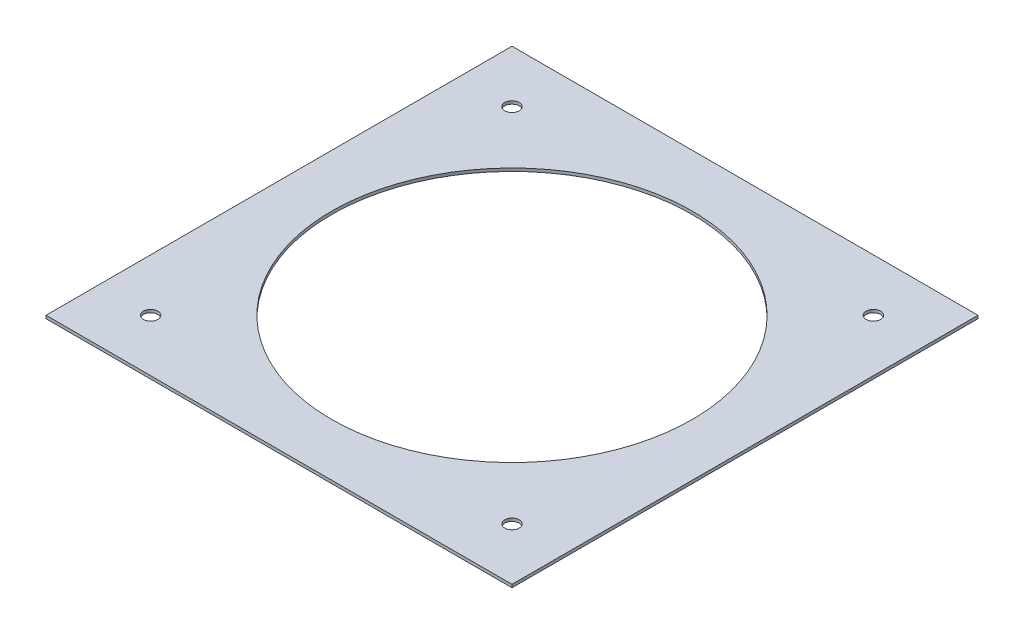
ISO-10303-21;
HEADER;
FILE_DESCRIPTION(('STEP AP214'),'2;1');
FILE_NAME('part.step','',(''),(''),'','','');
FILE_SCHEMA(('AUTOMOTIVE_DESIGN { 1 0 10303 214 1 1 1 1 }'));
ENDSEC;
DATA;
#1=APPLICATION_CONTEXT('core data for automotive mechanical design processes');
#2=APPLICATION_PROTOCOL_DEFINITION('international standard','automotive_design',2000,#1);
#3=PRODUCT_CONTEXT('',#1,'mechanical');
#4=PRODUCT('Part','Part','',(#3));
#5=PRODUCT_RELATED_PRODUCT_CATEGORY('part','',(#4));
#6=PRODUCT_DEFINITION_FORMATION('','',#4);
#7=PRODUCT_DEFINITION_CONTEXT('part definition',#1,'design');
#8=PRODUCT_DEFINITION('design','',#6,#7);
#9=PRODUCT_DEFINITION_SHAPE('','',#8);
#10=(LENGTH_UNIT() NAMED_UNIT(*) SI_UNIT(.MILLI.,.METRE.));
#11=(NAMED_UNIT(*) PLANE_ANGLE_UNIT() SI_UNIT($,.RADIAN.));
#12=(NAMED_UNIT(*) SI_UNIT($,.STERADIAN.) SOLID_ANGLE_UNIT());
#13=UNCERTAINTY_MEASURE_WITH_UNIT(LENGTH_MEASURE(1.E-05),#10,'distance_accuracy_value','');
#14=(GEOMETRIC_REPRESENTATION_CONTEXT(3) GLOBAL_UNCERTAINTY_ASSIGNED_CONTEXT((#13)) GLOBAL_UNIT_ASSIGNED_CONTEXT((#10,
#11,#12)) REPRESENTATION_CONTEXT('',''));
#15=CARTESIAN_POINT('',(0.,0.,0.));
#16=DIRECTION('',(0.,0.,1.));
#17=DIRECTION('',(1.,0.,0.));
#18=AXIS2_PLACEMENT_3D('',#15,#16,#17);
#19=CARTESIAN_POINT('',(0.,1.,77.5));
#20=DIRECTION('',(0.,0.,-1.));
#21=DIRECTION('',(-1.,0.,0.));
#22=AXIS2_PLACEMENT_3D('',#19,#20,#21);
#23=PLANE('',#22);
#24=DIRECTION('',(1.,0.,0.));
#25=VECTOR('',#24,1.);
#26=CARTESIAN_POINT('',(0.,0.,77.5));
#27=LINE('',#26,#25);
#28=CARTESIAN_POINT('',(-77.497806420569,0.,77.5));
#29=VERTEX_POINT('',#28);
#30=CARTESIAN_POINT('',(77.497806420569,0.,77.5));
#31=VERTEX_POINT('',#30);
#32=EDGE_CURVE('E155',#29,#31,#27,.T.);
#33=ORIENTED_EDGE('',*,*,#32,.T.);
#34=DIRECTION('',(0.,-1.,0.));
#35=VECTOR('',#34,1.);
#36=CARTESIAN_POINT('',(77.497806420569,1.,77.5));
#37=LINE('',#36,#35);
#38=CARTESIAN_POINT('',(77.497806420569,1.,77.5));
#39=VERTEX_POINT('',#38);
#40=EDGE_CURVE('E11',#39,#31,#37,.T.);
#41=ORIENTED_EDGE('',*,*,#40,.F.);
#42=DIRECTION('',(1.,0.,0.));
#43=VECTOR('',#42,1.);
#44=CARTESIAN_POINT('',(0.,1.,77.5));
#45=LINE('',#44,#43);
#46=CARTESIAN_POINT('',(-77.497806420569,1.,77.5));
#47=VERTEX_POINT('',#46);
#48=EDGE_CURVE('E201',#47,#39,#45,.T.);
#49=ORIENTED_EDGE('',*,*,#48,.F.);
#50=DIRECTION('',(0.,-1.,0.));
#51=VECTOR('',#50,1.);
#52=CARTESIAN_POINT('',(-77.497806420569,1.,77.5));
#53=LINE('',#52,#51);
#54=EDGE_CURVE('E147',#47,#29,#53,.T.);
#55=ORIENTED_EDGE('',*,*,#54,.T.);
#56=EDGE_LOOP('',(#33,#41,#49,#55));
#57=FACE_BOUND('',#56,.T.);
#58=ADVANCED_FACE('F44',(#57),#23,.F.);
#59=CARTESIAN_POINT('',(0.,1.,0.));
#60=DIRECTION('',(0.,-1.,0.));
#61=DIRECTION('',(0.,0.,-1.));
#62=AXIS2_PLACEMENT_3D('',#59,#60,#61);
#63=CYLINDRICAL_SURFACE('',#62,109.6);
#64=CARTESIAN_POINT('',(0.,0.,0.));
#65=DIRECTION('',(0.,1.,0.));
#66=DIRECTION('',(0.,0.,1.));
#67=AXIS2_PLACEMENT_3D('',#64,#65,#66);
#68=CIRCLE('',#67,109.6);
#69=CARTESIAN_POINT('',(77.5,0.,77.497806420569));
#70=VERTEX_POINT('',#69);
#71=EDGE_CURVE('E158',#31,#70,#68,.T.);
#72=ORIENTED_EDGE('',*,*,#71,.T.);
#73=DIRECTION('',(0.,-1.,0.));
#74=VECTOR('',#73,1.);
#75=CARTESIAN_POINT('',(77.5,1.,77.497806420569));
#76=LINE('',#75,#74);
#77=CARTESIAN_POINT('',(77.5,1.,77.497806420569));
#78=VERTEX_POINT('',#77);
#79=EDGE_CURVE('E53',#78,#70,#76,.T.);
#80=ORIENTED_EDGE('',*,*,#79,.F.);
#81=CARTESIAN_POINT('',(0.,1.,0.));
#82=DIRECTION('',(0.,1.,0.));
#83=DIRECTION('',(0.,0.,1.));
#84=AXIS2_PLACEMENT_3D('',#81,#82,#83);
#85=CIRCLE('',#84,109.6);
#86=EDGE_CURVE('E104',#39,#78,#85,.T.);
#87=ORIENTED_EDGE('',*,*,#86,.F.);
#88=ORIENTED_EDGE('',*,*,#40,.T.);
#89=EDGE_LOOP('',(#72,#80,#87,#88));
#90=FACE_BOUND('',#89,.T.);
#91=ADVANCED_FACE('F188',(#90),#63,.T.);
#92=CARTESIAN_POINT('',(77.5,1.,0.));
#93=DIRECTION('',(1.,0.,0.));
#94=DIRECTION('',(0.,0.,-1.));
#95=AXIS2_PLACEMENT_3D('',#92,#93,#94);
#96=PLANE('',#95);
#97=DIRECTION('',(0.,0.,1.));
#98=VECTOR('',#97,1.);
#99=CARTESIAN_POINT('',(77.5,0.,0.));
#100=LINE('',#99,#98);
#101=CARTESIAN_POINT('',(77.5,0.,-77.497806420569));
#102=VERTEX_POINT('',#101);
#103=EDGE_CURVE('E161',#102,#70,#100,.T.);
#104=ORIENTED_EDGE('',*,*,#103,.F.);
#105=DIRECTION('',(0.,-1.,0.));
#106=VECTOR('',#105,1.);
#107=CARTESIAN_POINT('',(77.5,1.,-77.497806420569));
#108=LINE('',#107,#106);
#109=CARTESIAN_POINT('',(77.5,1.,-77.497806420569));
#110=VERTEX_POINT('',#109);
#111=EDGE_CURVE('E181',#110,#102,#108,.T.);
#112=ORIENTED_EDGE('',*,*,#111,.F.);
#113=DIRECTION('',(0.,0.,1.));
#114=VECTOR('',#113,1.);
#115=CARTESIAN_POINT('',(77.5,1.,0.));
#116=LINE('',#115,#114);
#117=EDGE_CURVE('E187',#110,#78,#116,.T.);
#118=ORIENTED_EDGE('',*,*,#117,.T.);
#119=ORIENTED_EDGE('',*,*,#79,.T.);
#120=EDGE_LOOP('',(#104,#112,#118,#119));
#121=FACE_BOUND('',#120,.T.);
#122=ADVANCED_FACE('F185',(#121),#96,.T.);
#123=CARTESIAN_POINT('',(77.4978064205691,0.,-77.5));
#124=VERTEX_POINT('',#123);
#125=EDGE_CURVE('E162',#102,#124,#68,.T.);
#126=ORIENTED_EDGE('',*,*,#125,.T.);
#127=DIRECTION('',(0.,-1.,0.));
#128=VECTOR('',#127,1.);
#129=CARTESIAN_POINT('',(77.4978064205691,1.,-77.5));
#130=LINE('',#129,#128);
#131=CARTESIAN_POINT('',(77.4978064205691,1.,-77.5));
#132=VERTEX_POINT('',#131);
#133=EDGE_CURVE('E179',#132,#124,#130,.T.);
#134=ORIENTED_EDGE('',*,*,#133,.F.);
#135=EDGE_CURVE('E128',#110,#132,#85,.T.);
#136=ORIENTED_EDGE('',*,*,#135,.F.);
#137=ORIENTED_EDGE('',*,*,#111,.T.);
#138=EDGE_LOOP('',(#126,#134,#136,#137));
#139=FACE_BOUND('',#138,.T.);
#140=ADVANCED_FACE('F199',(#139),#63,.T.);
#141=CARTESIAN_POINT('',(0.,1.,-77.5));
#142=DIRECTION('',(0.,0.,-1.));
#143=DIRECTION('',(-1.,0.,0.));
#144=AXIS2_PLACEMENT_3D('',#141,#142,#143);
#145=PLANE('',#144);
#146=DIRECTION('',(1.,0.,0.));
#147=VECTOR('',#146,1.);
#148=CARTESIAN_POINT('',(0.,0.,-77.5));
#149=LINE('',#148,#147);
#150=CARTESIAN_POINT('',(-77.4978064205691,0.,-77.5));
#151=VERTEX_POINT('',#150);
#152=EDGE_CURVE('E165',#151,#124,#149,.T.);
#153=ORIENTED_EDGE('',*,*,#152,.F.);
#154=DIRECTION('',(0.,-1.,0.));
#155=VECTOR('',#154,1.);
#156=CARTESIAN_POINT('',(-77.4978064205691,1.,-77.5));
#157=LINE('',#156,#155);
#158=CARTESIAN_POINT('',(-77.4978064205691,1.,-77.5));
#159=VERTEX_POINT('',#158);
#160=EDGE_CURVE('E133',#159,#151,#157,.T.);
#161=ORIENTED_EDGE('',*,*,#160,.F.);
#162=DIRECTION('',(1.,0.,0.));
#163=VECTOR('',#162,1.);
#164=CARTESIAN_POINT('',(0.,1.,-77.5));
#165=LINE('',#164,#163);
#166=EDGE_CURVE('E125',#159,#132,#165,.T.);
#167=ORIENTED_EDGE('',*,*,#166,.T.);
#168=ORIENTED_EDGE('',*,*,#133,.T.);
#169=EDGE_LOOP('',(#153,#161,#167,#168));
#170=FACE_BOUND('',#169,.T.);
#171=ADVANCED_FACE('F252',(#170),#145,.T.);
#172=CARTESIAN_POINT('',(-77.5,0.,-77.497806420569));
#173=VERTEX_POINT('',#172);
#174=EDGE_CURVE('E132',#151,#173,#68,.T.);
#175=ORIENTED_EDGE('',*,*,#174,.T.);
#176=DIRECTION('',(0.,-1.,0.));
#177=VECTOR('',#176,1.);
#178=CARTESIAN_POINT('',(-77.5,1.,-77.497806420569));
#179=LINE('',#178,#177);
#180=CARTESIAN_POINT('',(-77.5,1.,-77.497806420569));
#181=VERTEX_POINT('',#180);
#182=EDGE_CURVE('E129',#181,#173,#179,.T.);
#183=ORIENTED_EDGE('',*,*,#182,.F.);
#184=EDGE_CURVE('E118',#159,#181,#85,.T.);
#185=ORIENTED_EDGE('',*,*,#184,.F.);
#186=ORIENTED_EDGE('',*,*,#160,.T.);
#187=EDGE_LOOP('',(#175,#183,#185,#186));
#188=FACE_BOUND('',#187,.T.);
#189=ADVANCED_FACE('F130',(#188),#63,.T.);
#190=CARTESIAN_POINT('',(-77.5,1.,0.));
#191=DIRECTION('',(1.,0.,0.));
#192=DIRECTION('',(0.,0.,-1.));
#193=AXIS2_PLACEMENT_3D('',#190,#191,#192);
#194=PLANE('',#193);
#195=DIRECTION('',(0.,0.,1.));
#196=VECTOR('',#195,1.);
#197=CARTESIAN_POINT('',(-77.5,0.,0.));
#198=LINE('',#197,#196);
#199=CARTESIAN_POINT('',(-77.5,0.,77.497806420569));
#200=VERTEX_POINT('',#199);
#201=EDGE_CURVE('E90',#173,#200,#198,.T.);
#202=ORIENTED_EDGE('',*,*,#201,.T.);
#203=DIRECTION('',(0.,-1.,0.));
#204=VECTOR('',#203,1.);
#205=CARTESIAN_POINT('',(-77.5,1.,77.497806420569));
#206=LINE('',#205,#204);
#207=CARTESIAN_POINT('',(-77.5,1.,77.497806420569));
#208=VERTEX_POINT('',#207);
#209=EDGE_CURVE('E134',#208,#200,#206,.T.);
#210=ORIENTED_EDGE('',*,*,#209,.F.);
#211=DIRECTION('',(0.,0.,1.));
#212=VECTOR('',#211,1.);
#213=CARTESIAN_POINT('',(-77.5,1.,0.));
#214=LINE('',#213,#212);
#215=EDGE_CURVE('E123',#181,#208,#214,.T.);
#216=ORIENTED_EDGE('',*,*,#215,.F.);
#217=ORIENTED_EDGE('',*,*,#182,.T.);
#218=EDGE_LOOP('',(#202,#210,#216,#217));
#219=FACE_BOUND('',#218,.T.);
#220=ADVANCED_FACE('F136',(#219),#194,.F.);
#221=CARTESIAN_POINT('',(60.0999999999999,1.,-60.1));
#222=DIRECTION('',(0.,-1.,0.));
#223=DIRECTION('',(0.,0.,-1.));
#224=AXIS2_PLACEMENT_3D('',#221,#222,#223);
#225=CYLINDRICAL_SURFACE('',#224,2.4);
#226=CARTESIAN_POINT('',(60.0999999999999,1.,-60.1));
#227=DIRECTION('',(0.,1.,0.));
#228=DIRECTION('',(0.,0.,1.));
#229=AXIS2_PLACEMENT_3D('',#226,#227,#228);
#230=CIRCLE('',#229,2.4);
#231=CARTESIAN_POINT('',(60.0999999999999,1.,-57.7));
#232=VERTEX_POINT('',#231);
#233=EDGE_CURVE('E138',#232,#232,#230,.T.);
#234=ORIENTED_EDGE('',*,*,#233,.T.);
#235=EDGE_LOOP('',(#234));
#236=FACE_BOUND('',#235,.T.);
#237=CARTESIAN_POINT('',(60.0999999999999,0.,-60.1));
#238=DIRECTION('',(0.,1.,0.));
#239=DIRECTION('',(0.,0.,1.));
#240=AXIS2_PLACEMENT_3D('',#237,#238,#239);
#241=CIRCLE('',#240,2.4);
#242=CARTESIAN_POINT('',(60.0999999999999,0.,-57.7));
#243=VERTEX_POINT('',#242);
#244=EDGE_CURVE('E169',#243,#243,#241,.T.);
#245=ORIENTED_EDGE('',*,*,#244,.F.);
#246=EDGE_LOOP('',(#245));
#247=FACE_BOUND('',#246,.T.);
#248=ADVANCED_FACE('F257',(#236,#247),#225,.F.);
#249=EDGE_CURVE('E96',#200,#29,#68,.T.);
#250=ORIENTED_EDGE('',*,*,#249,.T.);
#251=ORIENTED_EDGE('',*,*,#54,.F.);
#252=EDGE_CURVE('E61',#208,#47,#85,.T.);
#253=ORIENTED_EDGE('',*,*,#252,.F.);
#254=ORIENTED_EDGE('',*,*,#209,.T.);
#255=EDGE_LOOP('',(#250,#251,#253,#254));
#256=FACE_BOUND('',#255,.T.);
#257=ADVANCED_FACE('F234',(#256),#63,.T.);
#258=CARTESIAN_POINT('',(-60.1,1.,60.1));
#259=DIRECTION('',(0.,-1.,0.));
#260=DIRECTION('',(0.,0.,-1.));
#261=AXIS2_PLACEMENT_3D('',#258,#259,#260);
#262=CYLINDRICAL_SURFACE('',#261,2.4);
#263=CARTESIAN_POINT('',(-60.1,1.,60.1));
#264=DIRECTION('',(0.,1.,0.));
#265=DIRECTION('',(0.,0.,1.));
#266=AXIS2_PLACEMENT_3D('',#263,#264,#265);
#267=CIRCLE('',#266,2.4);
#268=CARTESIAN_POINT('',(-60.1,1.,62.5));
#269=VERTEX_POINT('',#268);
#270=EDGE_CURVE('E204',#269,#269,#267,.T.);
#271=ORIENTED_EDGE('',*,*,#270,.T.);
#272=EDGE_LOOP('',(#271));
#273=FACE_BOUND('',#272,.T.);
#274=CARTESIAN_POINT('',(-60.1,0.,60.1));
#275=DIRECTION('',(0.,1.,0.));
#276=DIRECTION('',(0.,0.,1.));
#277=AXIS2_PLACEMENT_3D('',#274,#275,#276);
#278=CIRCLE('',#277,2.4);
#279=CARTESIAN_POINT('',(-60.1,0.,62.5));
#280=VERTEX_POINT('',#279);
#281=EDGE_CURVE('E151',#280,#280,#278,.T.);
#282=ORIENTED_EDGE('',*,*,#281,.F.);
#283=EDGE_LOOP('',(#282));
#284=FACE_BOUND('',#283,.T.);
#285=ADVANCED_FACE('F231',(#273,#284),#262,.F.);
#286=CARTESIAN_POINT('',(60.1,1.,60.1));
#287=DIRECTION('',(0.,-1.,0.));
#288=DIRECTION('',(0.,0.,-1.));
#289=AXIS2_PLACEMENT_3D('',#286,#287,#288);
#290=CYLINDRICAL_SURFACE('',#289,2.4);
#291=CARTESIAN_POINT('',(60.1,1.,60.1));
#292=DIRECTION('',(0.,1.,0.));
#293=DIRECTION('',(0.,0.,1.));
#294=AXIS2_PLACEMENT_3D('',#291,#292,#293);
#295=CIRCLE('',#294,2.4);
#296=CARTESIAN_POINT('',(60.1,1.,62.5));
#297=VERTEX_POINT('',#296);
#298=EDGE_CURVE('E175',#297,#297,#295,.F.);
#299=ORIENTED_EDGE('',*,*,#298,.F.);
#300=EDGE_LOOP('',(#299));
#301=FACE_BOUND('',#300,.T.);
#302=CARTESIAN_POINT('',(60.1,0.,60.1));
#303=DIRECTION('',(0.,1.,0.));
#304=DIRECTION('',(0.,0.,1.));
#305=AXIS2_PLACEMENT_3D('',#302,#303,#304);
#306=CIRCLE('',#305,2.4);
#307=CARTESIAN_POINT('',(60.1,0.,62.5));
#308=VERTEX_POINT('',#307);
#309=EDGE_CURVE('E148',#308,#308,#306,.F.);
#310=ORIENTED_EDGE('',*,*,#309,.T.);
#311=EDGE_LOOP('',(#310));
#312=FACE_BOUND('',#311,.T.);
#313=ADVANCED_FACE('F46',(#301,#312),#290,.F.);
#314=CARTESIAN_POINT('',(-60.1,1.,-60.1));
#315=DIRECTION('',(0.,-1.,0.));
#316=DIRECTION('',(0.,0.,-1.));
#317=AXIS2_PLACEMENT_3D('',#314,#315,#316);
#318=CYLINDRICAL_SURFACE('',#317,2.4);
#319=CARTESIAN_POINT('',(-60.1,1.,-60.1));
#320=DIRECTION('',(0.,1.,0.));
#321=DIRECTION('',(0.,0.,1.));
#322=AXIS2_PLACEMENT_3D('',#319,#320,#321);
#323=CIRCLE('',#322,2.4);
#324=CARTESIAN_POINT('',(-60.1,1.,-57.7));
#325=VERTEX_POINT('',#324);
#326=EDGE_CURVE('E144',#325,#325,#323,.F.);
#327=ORIENTED_EDGE('',*,*,#326,.F.);
#328=EDGE_LOOP('',(#327));
#329=FACE_BOUND('',#328,.T.);
#330=CARTESIAN_POINT('',(-60.1,0.,-60.1));
#331=DIRECTION('',(0.,1.,0.));
#332=DIRECTION('',(0.,0.,1.));
#333=AXIS2_PLACEMENT_3D('',#330,#331,#332);
#334=CIRCLE('',#333,2.4);
#335=CARTESIAN_POINT('',(-60.1,0.,-57.7));
#336=VERTEX_POINT('',#335);
#337=EDGE_CURVE('E172',#336,#336,#334,.F.);
#338=ORIENTED_EDGE('',*,*,#337,.T.);
#339=EDGE_LOOP('',(#338));
#340=FACE_BOUND('',#339,.T.);
#341=ADVANCED_FACE('F225',(#329,#340),#318,.F.);
#342=CARTESIAN_POINT('',(0.,1.,0.));
#343=DIRECTION('',(0.,1.,0.));
#344=DIRECTION('',(0.,0.,1.));
#345=AXIS2_PLACEMENT_3D('',#342,#343,#344);
#346=PLANE('',#345);
#347=CARTESIAN_POINT('',(0.,1.,0.));
#348=DIRECTION('',(0.,1.,0.));
#349=DIRECTION('',(0.,0.,1.));
#350=AXIS2_PLACEMENT_3D('',#347,#348,#349);
#351=CIRCLE('',#350,60.);
#352=CARTESIAN_POINT('',(0.,1.,60.));
#353=VERTEX_POINT('',#352);
#354=EDGE_CURVE('E209',#353,#353,#351,.T.);
#355=ORIENTED_EDGE('',*,*,#354,.F.);
#356=EDGE_LOOP('',(#355));
#357=FACE_BOUND('',#356,.T.);
#358=ORIENTED_EDGE('',*,*,#298,.T.);
#359=EDGE_LOOP('',(#358));
#360=FACE_BOUND('',#359,.T.);
#361=ORIENTED_EDGE('',*,*,#270,.F.);
#362=EDGE_LOOP('',(#361));
#363=FACE_BOUND('',#362,.T.);
#364=ORIENTED_EDGE('',*,*,#48,.T.);
#365=ORIENTED_EDGE('',*,*,#86,.T.);
#366=ORIENTED_EDGE('',*,*,#117,.F.);
#367=ORIENTED_EDGE('',*,*,#135,.T.);
#368=ORIENTED_EDGE('',*,*,#166,.F.);
#369=ORIENTED_EDGE('',*,*,#184,.T.);
#370=ORIENTED_EDGE('',*,*,#215,.T.);
#371=ORIENTED_EDGE('',*,*,#252,.T.);
#372=EDGE_LOOP('',(#364,#365,#366,#367,#368,#369,#370,#371));
#373=FACE_BOUND('',#372,.T.);
#374=ORIENTED_EDGE('',*,*,#233,.F.);
#375=EDGE_LOOP('',(#374));
#376=FACE_BOUND('',#375,.T.);
#377=ORIENTED_EDGE('',*,*,#326,.T.);
#378=EDGE_LOOP('',(#377));
#379=FACE_BOUND('',#378,.T.);
#380=ADVANCED_FACE('F120',(#357,#360,#363,#373,#376,#379),#346,.T.);
#381=CARTESIAN_POINT('',(0.,0.,0.));
#382=DIRECTION('',(0.,1.,0.));
#383=DIRECTION('',(0.,0.,1.));
#384=AXIS2_PLACEMENT_3D('',#381,#382,#383);
#385=PLANE('',#384);
#386=CARTESIAN_POINT('',(0.,0.,0.));
#387=DIRECTION('',(0.,1.,0.));
#388=DIRECTION('',(0.,0.,1.));
#389=AXIS2_PLACEMENT_3D('',#386,#387,#388);
#390=CIRCLE('',#389,60.);
#391=CARTESIAN_POINT('',(0.,0.,60.));
#392=VERTEX_POINT('',#391);
#393=EDGE_CURVE('E152',#392,#392,#390,.T.);
#394=ORIENTED_EDGE('',*,*,#393,.T.);
#395=EDGE_LOOP('',(#394));
#396=FACE_BOUND('',#395,.T.);
#397=ORIENTED_EDGE('',*,*,#309,.F.);
#398=EDGE_LOOP('',(#397));
#399=FACE_BOUND('',#398,.T.);
#400=ORIENTED_EDGE('',*,*,#281,.T.);
#401=EDGE_LOOP('',(#400));
#402=FACE_BOUND('',#401,.T.);
#403=ORIENTED_EDGE('',*,*,#32,.F.);
#404=ORIENTED_EDGE('',*,*,#249,.F.);
#405=ORIENTED_EDGE('',*,*,#201,.F.);
#406=ORIENTED_EDGE('',*,*,#174,.F.);
#407=ORIENTED_EDGE('',*,*,#152,.T.);
#408=ORIENTED_EDGE('',*,*,#125,.F.);
#409=ORIENTED_EDGE('',*,*,#103,.T.);
#410=ORIENTED_EDGE('',*,*,#71,.F.);
#411=EDGE_LOOP('',(#403,#404,#405,#406,#407,#408,#409,#410));
#412=FACE_BOUND('',#411,.T.);
#413=ORIENTED_EDGE('',*,*,#244,.T.);
#414=EDGE_LOOP('',(#413));
#415=FACE_BOUND('',#414,.T.);
#416=ORIENTED_EDGE('',*,*,#337,.F.);
#417=EDGE_LOOP('',(#416));
#418=FACE_BOUND('',#417,.T.);
#419=ADVANCED_FACE('F193',(#396,#399,#402,#412,#415,#418),#385,.F.);
#420=CARTESIAN_POINT('',(0.,0.,0.));
#421=DIRECTION('',(0.,1.,0.));
#422=DIRECTION('',(0.,0.,1.));
#423=AXIS2_PLACEMENT_3D('',#420,#421,#422);
#424=CYLINDRICAL_SURFACE('',#423,60.);
#425=ORIENTED_EDGE('',*,*,#393,.F.);
#426=EDGE_LOOP('',(#425));
#427=FACE_BOUND('',#426,.T.);
#428=ORIENTED_EDGE('',*,*,#354,.T.);
#429=EDGE_LOOP('',(#428));
#430=FACE_BOUND('',#429,.T.);
#431=ADVANCED_FACE('F217',(#427,#430),#424,.F.);
#432=CLOSED_SHELL('',(#58,#91,#122,#140,#171,#189,#220,#248,#257,#285,#313,#341,#380,#419,#431));
#433=MANIFOLD_SOLID_BREP('B2',#432);
#434=ADVANCED_BREP_SHAPE_REPRESENTATION('',(#18,#433),#14);
#435=SHAPE_DEFINITION_REPRESENTATION(#9,#434);
ENDSEC;
END-ISO-10303-21;
